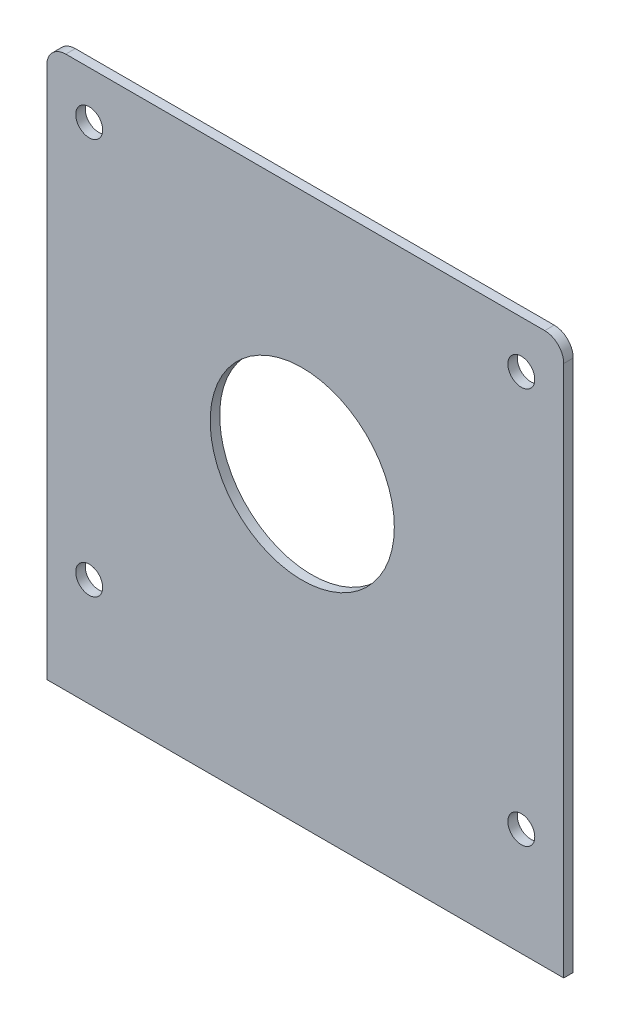
ISO-10303-21;
HEADER;
FILE_DESCRIPTION(('STEP AP214'),'2;1');
FILE_NAME('part.step','',(''),(''),'','','');
FILE_SCHEMA(('AUTOMOTIVE_DESIGN { 1 0 10303 214 1 1 1 1 }'));
ENDSEC;
DATA;
#1=APPLICATION_CONTEXT('core data for automotive mechanical design processes');
#2=APPLICATION_PROTOCOL_DEFINITION('international standard','automotive_design',2000,#1);
#3=PRODUCT_CONTEXT('',#1,'mechanical');
#4=PRODUCT('Part','Part','',(#3));
#5=PRODUCT_RELATED_PRODUCT_CATEGORY('part','',(#4));
#6=PRODUCT_DEFINITION_FORMATION('','',#4);
#7=PRODUCT_DEFINITION_CONTEXT('part definition',#1,'design');
#8=PRODUCT_DEFINITION('design','',#6,#7);
#9=PRODUCT_DEFINITION_SHAPE('','',#8);
#10=(LENGTH_UNIT() NAMED_UNIT(*) SI_UNIT(.MILLI.,.METRE.));
#11=(NAMED_UNIT(*) PLANE_ANGLE_UNIT() SI_UNIT($,.RADIAN.));
#12=(NAMED_UNIT(*) SI_UNIT($,.STERADIAN.) SOLID_ANGLE_UNIT());
#13=UNCERTAINTY_MEASURE_WITH_UNIT(LENGTH_MEASURE(1.E-05),#10,'distance_accuracy_value','');
#14=(GEOMETRIC_REPRESENTATION_CONTEXT(3) GLOBAL_UNCERTAINTY_ASSIGNED_CONTEXT((#13)) GLOBAL_UNIT_ASSIGNED_CONTEXT((#10,
#11,#12)) REPRESENTATION_CONTEXT('',''));
#15=CARTESIAN_POINT('',(0.,0.,0.));
#16=DIRECTION('',(0.,0.,1.));
#17=DIRECTION('',(1.,0.,0.));
#18=AXIS2_PLACEMENT_3D('',#15,#16,#17);
#19=CARTESIAN_POINT('',(43.18,-42.8625,0.79375));
#20=DIRECTION('',(-1.,0.,0.));
#21=DIRECTION('',(0.,0.,1.));
#22=AXIS2_PLACEMENT_3D('',#19,#20,#21);
#23=PLANE('',#22);
#24=DIRECTION('',(0.,1.,0.));
#25=VECTOR('',#24,1.);
#26=CARTESIAN_POINT('',(43.18,-42.8625,-0.79375));
#27=LINE('',#26,#25);
#28=CARTESIAN_POINT('',(43.18,-49.2125,-0.79375));
#29=VERTEX_POINT('',#28);
#30=CARTESIAN_POINT('',(43.18,39.6875,-0.79375));
#31=VERTEX_POINT('',#30);
#32=EDGE_CURVE('E113',#29,#31,#27,.T.);
#33=ORIENTED_EDGE('',*,*,#32,.T.);
#34=DIRECTION('',(0.,0.,-1.));
#35=VECTOR('',#34,1.);
#36=CARTESIAN_POINT('',(43.18,39.6875,0.79375));
#37=LINE('',#36,#35);
#38=CARTESIAN_POINT('',(43.18,39.6875,0.79375));
#39=VERTEX_POINT('',#38);
#40=EDGE_CURVE('E11',#31,#39,#37,.F.);
#41=ORIENTED_EDGE('',*,*,#40,.T.);
#42=DIRECTION('',(0.,1.,0.));
#43=VECTOR('',#42,1.);
#44=CARTESIAN_POINT('',(43.18,-42.8625,0.79375));
#45=LINE('',#44,#43);
#46=CARTESIAN_POINT('',(43.18,-49.2125,0.79375));
#47=VERTEX_POINT('',#46);
#48=EDGE_CURVE('E100',#47,#39,#45,.T.);
#49=ORIENTED_EDGE('',*,*,#48,.F.);
#50=DIRECTION('',(0.,0.,1.));
#51=VECTOR('',#50,1.);
#52=CARTESIAN_POINT('',(43.18,-49.2125,-0.79375));
#53=LINE('',#52,#51);
#54=EDGE_CURVE('E110',#29,#47,#53,.T.);
#55=ORIENTED_EDGE('',*,*,#54,.F.);
#56=EDGE_LOOP('',(#33,#41,#49,#55));
#57=FACE_BOUND('',#56,.T.);
#58=ADVANCED_FACE('F35',(#57),#23,.F.);
#59=CARTESIAN_POINT('',(43.18,42.8625,0.79375));
#60=DIRECTION('',(0.,-1.,0.));
#61=DIRECTION('',(0.,0.,-1.));
#62=AXIS2_PLACEMENT_3D('',#59,#60,#61);
#63=PLANE('',#62);
#64=DIRECTION('',(-1.,0.,0.));
#65=VECTOR('',#64,1.);
#66=CARTESIAN_POINT('',(43.18,42.8625,-0.79375));
#67=LINE('',#66,#65);
#68=CARTESIAN_POINT('',(40.005,42.8625,-0.79375));
#69=VERTEX_POINT('',#68);
#70=CARTESIAN_POINT('',(-40.005,42.8625,-0.79375));
#71=VERTEX_POINT('',#70);
#72=EDGE_CURVE('E101',#69,#71,#67,.T.);
#73=ORIENTED_EDGE('',*,*,#72,.T.);
#74=DIRECTION('',(0.,0.,-1.));
#75=VECTOR('',#74,1.);
#76=CARTESIAN_POINT('',(-40.005,42.8625,0.79375));
#77=LINE('',#76,#75);
#78=CARTESIAN_POINT('',(-40.005,42.8625,0.79375));
#79=VERTEX_POINT('',#78);
#80=EDGE_CURVE('E56',#71,#79,#77,.F.);
#81=ORIENTED_EDGE('',*,*,#80,.T.);
#82=DIRECTION('',(-1.,0.,0.));
#83=VECTOR('',#82,1.);
#84=CARTESIAN_POINT('',(43.18,42.8625,0.79375));
#85=LINE('',#84,#83);
#86=CARTESIAN_POINT('',(40.005,42.8625,0.79375));
#87=VERTEX_POINT('',#86);
#88=EDGE_CURVE('E150',#87,#79,#85,.T.);
#89=ORIENTED_EDGE('',*,*,#88,.F.);
#90=DIRECTION('',(0.,0.,-1.));
#91=VECTOR('',#90,1.);
#92=CARTESIAN_POINT('',(40.005,42.8625,0.79375));
#93=LINE('',#92,#91);
#94=EDGE_CURVE('E161',#87,#69,#93,.T.);
#95=ORIENTED_EDGE('',*,*,#94,.T.);
#96=EDGE_LOOP('',(#73,#81,#89,#95));
#97=FACE_BOUND('',#96,.T.);
#98=ADVANCED_FACE('F172',(#97),#63,.F.);
#99=CARTESIAN_POINT('',(-43.18,42.8625,0.79375));
#100=DIRECTION('',(1.,0.,0.));
#101=DIRECTION('',(0.,0.,-1.));
#102=AXIS2_PLACEMENT_3D('',#99,#100,#101);
#103=PLANE('',#102);
#104=DIRECTION('',(0.,-1.,0.));
#105=VECTOR('',#104,1.);
#106=CARTESIAN_POINT('',(-43.18,42.8625,0.79375));
#107=LINE('',#106,#105);
#108=CARTESIAN_POINT('',(-43.18,39.6875,0.79375));
#109=VERTEX_POINT('',#108);
#110=CARTESIAN_POINT('',(-43.18,-49.2125,0.79375));
#111=VERTEX_POINT('',#110);
#112=EDGE_CURVE('E152',#109,#111,#107,.T.);
#113=ORIENTED_EDGE('',*,*,#112,.F.);
#114=DIRECTION('',(0.,0.,-1.));
#115=VECTOR('',#114,1.);
#116=CARTESIAN_POINT('',(-43.18,39.6875,0.79375));
#117=LINE('',#116,#115);
#118=CARTESIAN_POINT('',(-43.18,39.6875,-0.79375));
#119=VERTEX_POINT('',#118);
#120=EDGE_CURVE('E97',#109,#119,#117,.T.);
#121=ORIENTED_EDGE('',*,*,#120,.T.);
#122=DIRECTION('',(0.,-1.,0.));
#123=VECTOR('',#122,1.);
#124=CARTESIAN_POINT('',(-43.18,42.8625,-0.79375));
#125=LINE('',#124,#123);
#126=CARTESIAN_POINT('',(-43.18,-49.2125,-0.79375));
#127=VERTEX_POINT('',#126);
#128=EDGE_CURVE('E90',#119,#127,#125,.T.);
#129=ORIENTED_EDGE('',*,*,#128,.T.);
#130=DIRECTION('',(0.,0.,1.));
#131=VECTOR('',#130,1.);
#132=CARTESIAN_POINT('',(-43.18,-49.2125,-0.79375));
#133=LINE('',#132,#131);
#134=EDGE_CURVE('E94',#127,#111,#133,.T.);
#135=ORIENTED_EDGE('',*,*,#134,.T.);
#136=EDGE_LOOP('',(#113,#121,#129,#135));
#137=FACE_BOUND('',#136,.T.);
#138=ADVANCED_FACE('F93',(#137),#103,.F.);
#139=CARTESIAN_POINT('',(0.,0.,0.79375));
#140=DIRECTION('',(0.,0.,1.));
#141=DIRECTION('',(1.,0.,0.));
#142=AXIS2_PLACEMENT_3D('',#139,#140,#141);
#143=PLANE('',#142);
#144=CARTESIAN_POINT('',(36.0913702497801,34.9538702497801,0.79375));
#145=DIRECTION('',(0.,0.,1.));
#146=DIRECTION('',(1.,0.,0.));
#147=AXIS2_PLACEMENT_3D('',#144,#145,#146);
#148=CIRCLE('',#147,2.25);
#149=CARTESIAN_POINT('',(38.3413702497801,34.9538702497801,0.79375));
#150=VERTEX_POINT('',#149);
#151=EDGE_CURVE('E118',#150,#150,#148,.T.);
#152=ORIENTED_EDGE('',*,*,#151,.F.);
#153=EDGE_LOOP('',(#152));
#154=FACE_BOUND('',#153,.T.);
#155=CARTESIAN_POINT('',(36.0913702497801,-31.2288702497801,0.79375));
#156=DIRECTION('',(0.,0.,1.));
#157=DIRECTION('',(1.,0.,0.));
#158=AXIS2_PLACEMENT_3D('',#155,#156,#157);
#159=CIRCLE('',#158,2.25);
#160=CARTESIAN_POINT('',(38.3413702497801,-31.2288702497801,0.79375));
#161=VERTEX_POINT('',#160);
#162=EDGE_CURVE('E125',#161,#161,#159,.T.);
#163=ORIENTED_EDGE('',*,*,#162,.F.);
#164=EDGE_LOOP('',(#163));
#165=FACE_BOUND('',#164,.T.);
#166=CARTESIAN_POINT('',(-36.0913702497801,34.9538702497801,0.79375));
#167=DIRECTION('',(0.,0.,1.));
#168=DIRECTION('',(1.,0.,0.));
#169=AXIS2_PLACEMENT_3D('',#166,#167,#168);
#170=CIRCLE('',#169,2.25);
#171=CARTESIAN_POINT('',(-33.8413702497801,34.9538702497801,0.79375));
#172=VERTEX_POINT('',#171);
#173=EDGE_CURVE('E131',#172,#172,#170,.T.);
#174=ORIENTED_EDGE('',*,*,#173,.F.);
#175=EDGE_LOOP('',(#174));
#176=FACE_BOUND('',#175,.T.);
#177=CARTESIAN_POINT('',(-36.0913702497801,-31.2288702497802,0.79375));
#178=DIRECTION('',(0.,0.,1.));
#179=DIRECTION('',(1.,0.,0.));
#180=AXIS2_PLACEMENT_3D('',#177,#178,#179);
#181=CIRCLE('',#180,2.25);
#182=CARTESIAN_POINT('',(-33.8413702497801,-31.2288702497802,0.79375));
#183=VERTEX_POINT('',#182);
#184=EDGE_CURVE('E137',#183,#183,#181,.T.);
#185=ORIENTED_EDGE('',*,*,#184,.F.);
#186=EDGE_LOOP('',(#185));
#187=FACE_BOUND('',#186,.T.);
#188=CARTESIAN_POINT('',(-0.500000000000037,1.8625,0.79375));
#189=DIRECTION('',(0.,0.,1.));
#190=DIRECTION('',(1.,0.,0.));
#191=AXIS2_PLACEMENT_3D('',#188,#189,#190);
#192=CIRCLE('',#191,15.380999972);
#193=CARTESIAN_POINT('',(14.880999972,1.8625,0.79375));
#194=VERTEX_POINT('',#193);
#195=EDGE_CURVE('E143',#194,#194,#192,.T.);
#196=ORIENTED_EDGE('',*,*,#195,.F.);
#197=EDGE_LOOP('',(#196));
#198=FACE_BOUND('',#197,.T.);
#199=ORIENTED_EDGE('',*,*,#88,.T.);
#200=CARTESIAN_POINT('',(-40.005,39.6875,0.79375));
#201=DIRECTION('',(0.,0.,1.));
#202=DIRECTION('',(1.,0.,0.));
#203=AXIS2_PLACEMENT_3D('',#200,#201,#202);
#204=CIRCLE('',#203,3.175);
#205=EDGE_CURVE('E43',#79,#109,#204,.T.);
#206=ORIENTED_EDGE('',*,*,#205,.T.);
#207=ORIENTED_EDGE('',*,*,#112,.T.);
#208=DIRECTION('',(1.,0.,0.));
#209=VECTOR('',#208,1.);
#210=CARTESIAN_POINT('',(43.18,-49.2125,0.79375));
#211=LINE('',#210,#209);
#212=EDGE_CURVE('E109',#111,#47,#211,.T.);
#213=ORIENTED_EDGE('',*,*,#212,.T.);
#214=ORIENTED_EDGE('',*,*,#48,.T.);
#215=CARTESIAN_POINT('',(40.005,39.6875,0.79375));
#216=DIRECTION('',(0.,0.,1.));
#217=DIRECTION('',(1.,0.,0.));
#218=AXIS2_PLACEMENT_3D('',#215,#216,#217);
#219=CIRCLE('',#218,3.175);
#220=EDGE_CURVE('E165',#39,#87,#219,.T.);
#221=ORIENTED_EDGE('',*,*,#220,.T.);
#222=EDGE_LOOP('',(#199,#206,#207,#213,#214,#221));
#223=FACE_BOUND('',#222,.T.);
#224=ADVANCED_FACE('F168',(#154,#165,#176,#187,#198,#223),#143,.T.);
#225=CARTESIAN_POINT('',(0.,0.,-0.79375));
#226=DIRECTION('',(0.,0.,1.));
#227=DIRECTION('',(1.,0.,0.));
#228=AXIS2_PLACEMENT_3D('',#225,#226,#227);
#229=PLANE('',#228);
#230=CARTESIAN_POINT('',(36.0913702497801,34.9538702497801,-0.79375));
#231=DIRECTION('',(0.,0.,1.));
#232=DIRECTION('',(1.,0.,0.));
#233=AXIS2_PLACEMENT_3D('',#230,#231,#232);
#234=CIRCLE('',#233,2.25);
#235=CARTESIAN_POINT('',(38.3413702497801,34.9538702497801,-0.79375));
#236=VERTEX_POINT('',#235);
#237=EDGE_CURVE('E122',#236,#236,#234,.T.);
#238=ORIENTED_EDGE('',*,*,#237,.T.);
#239=EDGE_LOOP('',(#238));
#240=FACE_BOUND('',#239,.T.);
#241=CARTESIAN_POINT('',(36.0913702497801,-31.2288702497801,-0.79375));
#242=DIRECTION('',(0.,0.,1.));
#243=DIRECTION('',(1.,0.,0.));
#244=AXIS2_PLACEMENT_3D('',#241,#242,#243);
#245=CIRCLE('',#244,2.25);
#246=CARTESIAN_POINT('',(38.3413702497801,-31.2288702497801,-0.79375));
#247=VERTEX_POINT('',#246);
#248=EDGE_CURVE('E128',#247,#247,#245,.T.);
#249=ORIENTED_EDGE('',*,*,#248,.T.);
#250=EDGE_LOOP('',(#249));
#251=FACE_BOUND('',#250,.T.);
#252=CARTESIAN_POINT('',(-36.0913702497801,34.9538702497801,-0.79375));
#253=DIRECTION('',(0.,0.,1.));
#254=DIRECTION('',(1.,0.,0.));
#255=AXIS2_PLACEMENT_3D('',#252,#253,#254);
#256=CIRCLE('',#255,2.25);
#257=CARTESIAN_POINT('',(-33.8413702497801,34.9538702497801,-0.79375));
#258=VERTEX_POINT('',#257);
#259=EDGE_CURVE('E134',#258,#258,#256,.T.);
#260=ORIENTED_EDGE('',*,*,#259,.T.);
#261=EDGE_LOOP('',(#260));
#262=FACE_BOUND('',#261,.T.);
#263=CARTESIAN_POINT('',(-36.0913702497801,-31.2288702497802,-0.79375));
#264=DIRECTION('',(0.,0.,1.));
#265=DIRECTION('',(1.,0.,0.));
#266=AXIS2_PLACEMENT_3D('',#263,#264,#265);
#267=CIRCLE('',#266,2.25);
#268=CARTESIAN_POINT('',(-33.8413702497801,-31.2288702497802,-0.79375));
#269=VERTEX_POINT('',#268);
#270=EDGE_CURVE('E140',#269,#269,#267,.T.);
#271=ORIENTED_EDGE('',*,*,#270,.T.);
#272=EDGE_LOOP('',(#271));
#273=FACE_BOUND('',#272,.T.);
#274=CARTESIAN_POINT('',(-0.500000000000037,1.8625,-0.79375));
#275=DIRECTION('',(0.,0.,1.));
#276=DIRECTION('',(1.,0.,0.));
#277=AXIS2_PLACEMENT_3D('',#274,#275,#276);
#278=CIRCLE('',#277,15.380999972);
#279=CARTESIAN_POINT('',(14.880999972,1.8625,-0.79375));
#280=VERTEX_POINT('',#279);
#281=EDGE_CURVE('E144',#280,#280,#278,.T.);
#282=ORIENTED_EDGE('',*,*,#281,.T.);
#283=EDGE_LOOP('',(#282));
#284=FACE_BOUND('',#283,.T.);
#285=ORIENTED_EDGE('',*,*,#128,.F.);
#286=CARTESIAN_POINT('',(-40.005,39.6875,-0.79375));
#287=DIRECTION('',(0.,0.,1.));
#288=DIRECTION('',(1.,0.,0.));
#289=AXIS2_PLACEMENT_3D('',#286,#287,#288);
#290=CIRCLE('',#289,3.175);
#291=EDGE_CURVE('E159',#119,#71,#290,.F.);
#292=ORIENTED_EDGE('',*,*,#291,.T.);
#293=ORIENTED_EDGE('',*,*,#72,.F.);
#294=CARTESIAN_POINT('',(40.005,39.6875,-0.79375));
#295=DIRECTION('',(0.,0.,1.));
#296=DIRECTION('',(1.,0.,0.));
#297=AXIS2_PLACEMENT_3D('',#294,#295,#296);
#298=CIRCLE('',#297,3.175);
#299=EDGE_CURVE('E157',#69,#31,#298,.F.);
#300=ORIENTED_EDGE('',*,*,#299,.T.);
#301=ORIENTED_EDGE('',*,*,#32,.F.);
#302=DIRECTION('',(1.,0.,0.));
#303=VECTOR('',#302,1.);
#304=CARTESIAN_POINT('',(43.18,-49.2125,-0.79375));
#305=LINE('',#304,#303);
#306=EDGE_CURVE('E107',#127,#29,#305,.T.);
#307=ORIENTED_EDGE('',*,*,#306,.F.);
#308=EDGE_LOOP('',(#285,#292,#293,#300,#301,#307));
#309=FACE_BOUND('',#308,.T.);
#310=ADVANCED_FACE('F112',(#240,#251,#262,#273,#284,#309),#229,.F.);
#311=CARTESIAN_POINT('',(-0.500000000000037,1.8625,-0.79375));
#312=DIRECTION('',(0.,0.,1.));
#313=DIRECTION('',(1.,0.,0.));
#314=AXIS2_PLACEMENT_3D('',#311,#312,#313);
#315=CYLINDRICAL_SURFACE('',#314,15.380999972);
#316=ORIENTED_EDGE('',*,*,#281,.F.);
#317=EDGE_LOOP('',(#316));
#318=FACE_BOUND('',#317,.T.);
#319=ORIENTED_EDGE('',*,*,#195,.T.);
#320=EDGE_LOOP('',(#319));
#321=FACE_BOUND('',#320,.T.);
#322=ADVANCED_FACE('F207',(#318,#321),#315,.F.);
#323=CARTESIAN_POINT('',(-36.0913702497801,-31.2288702497802,0.79375));
#324=DIRECTION('',(0.,0.,1.));
#325=DIRECTION('',(1.,0.,0.));
#326=AXIS2_PLACEMENT_3D('',#323,#324,#325);
#327=CYLINDRICAL_SURFACE('',#326,2.25);
#328=ORIENTED_EDGE('',*,*,#270,.F.);
#329=EDGE_LOOP('',(#328));
#330=FACE_BOUND('',#329,.T.);
#331=ORIENTED_EDGE('',*,*,#184,.T.);
#332=EDGE_LOOP('',(#331));
#333=FACE_BOUND('',#332,.T.);
#334=ADVANCED_FACE('F203',(#330,#333),#327,.F.);
#335=CARTESIAN_POINT('',(-36.0913702497801,34.9538702497801,0.79375));
#336=DIRECTION('',(0.,0.,1.));
#337=DIRECTION('',(1.,0.,0.));
#338=AXIS2_PLACEMENT_3D('',#335,#336,#337);
#339=CYLINDRICAL_SURFACE('',#338,2.25);
#340=ORIENTED_EDGE('',*,*,#259,.F.);
#341=EDGE_LOOP('',(#340));
#342=FACE_BOUND('',#341,.T.);
#343=ORIENTED_EDGE('',*,*,#173,.T.);
#344=EDGE_LOOP('',(#343));
#345=FACE_BOUND('',#344,.T.);
#346=ADVANCED_FACE('F199',(#342,#345),#339,.F.);
#347=CARTESIAN_POINT('',(36.0913702497801,-31.2288702497801,0.79375));
#348=DIRECTION('',(0.,0.,1.));
#349=DIRECTION('',(1.,0.,0.));
#350=AXIS2_PLACEMENT_3D('',#347,#348,#349);
#351=CYLINDRICAL_SURFACE('',#350,2.25);
#352=ORIENTED_EDGE('',*,*,#248,.F.);
#353=EDGE_LOOP('',(#352));
#354=FACE_BOUND('',#353,.T.);
#355=ORIENTED_EDGE('',*,*,#162,.T.);
#356=EDGE_LOOP('',(#355));
#357=FACE_BOUND('',#356,.T.);
#358=ADVANCED_FACE('F193',(#354,#357),#351,.F.);
#359=CARTESIAN_POINT('',(36.0913702497801,34.9538702497801,0.79375));
#360=DIRECTION('',(0.,0.,1.));
#361=DIRECTION('',(1.,0.,0.));
#362=AXIS2_PLACEMENT_3D('',#359,#360,#361);
#363=CYLINDRICAL_SURFACE('',#362,2.25);
#364=ORIENTED_EDGE('',*,*,#237,.F.);
#365=EDGE_LOOP('',(#364));
#366=FACE_BOUND('',#365,.T.);
#367=ORIENTED_EDGE('',*,*,#151,.T.);
#368=EDGE_LOOP('',(#367));
#369=FACE_BOUND('',#368,.T.);
#370=ADVANCED_FACE('F188',(#366,#369),#363,.F.);
#371=CARTESIAN_POINT('',(43.18,-49.2125,-0.79375));
#372=DIRECTION('',(0.,-1.,0.));
#373=DIRECTION('',(1.,0.,0.));
#374=AXIS2_PLACEMENT_3D('',#371,#372,#373);
#375=PLANE('',#374);
#376=ORIENTED_EDGE('',*,*,#212,.F.);
#377=ORIENTED_EDGE('',*,*,#134,.F.);
#378=ORIENTED_EDGE('',*,*,#306,.T.);
#379=ORIENTED_EDGE('',*,*,#54,.T.);
#380=EDGE_LOOP('',(#376,#377,#378,#379));
#381=FACE_BOUND('',#380,.T.);
#382=ADVANCED_FACE('F105',(#381),#375,.T.);
#383=CARTESIAN_POINT('',(-40.005,39.6875,0.79375));
#384=DIRECTION('',(0.,0.,-1.));
#385=DIRECTION('',(-1.,0.,0.));
#386=AXIS2_PLACEMENT_3D('',#383,#384,#385);
#387=CYLINDRICAL_SURFACE('',#386,3.175);
#388=ORIENTED_EDGE('',*,*,#205,.F.);
#389=ORIENTED_EDGE('',*,*,#80,.F.);
#390=ORIENTED_EDGE('',*,*,#291,.F.);
#391=ORIENTED_EDGE('',*,*,#120,.F.);
#392=EDGE_LOOP('',(#388,#389,#390,#391));
#393=FACE_BOUND('',#392,.T.);
#394=ADVANCED_FACE('F170',(#393),#387,.T.);
#395=CARTESIAN_POINT('',(40.005,39.6875,0.79375));
#396=DIRECTION('',(0.,0.,-1.));
#397=DIRECTION('',(-1.,0.,0.));
#398=AXIS2_PLACEMENT_3D('',#395,#396,#397);
#399=CYLINDRICAL_SURFACE('',#398,3.175);
#400=ORIENTED_EDGE('',*,*,#220,.F.);
#401=ORIENTED_EDGE('',*,*,#40,.F.);
#402=ORIENTED_EDGE('',*,*,#299,.F.);
#403=ORIENTED_EDGE('',*,*,#94,.F.);
#404=EDGE_LOOP('',(#400,#401,#402,#403));
#405=FACE_BOUND('',#404,.T.);
#406=ADVANCED_FACE('F37',(#405),#399,.T.);
#407=CLOSED_SHELL('',(#58,#98,#138,#224,#310,#322,#334,#346,#358,#370,#382,#394,#406));
#408=MANIFOLD_SOLID_BREP('B2',#407);
#409=ADVANCED_BREP_SHAPE_REPRESENTATION('',(#18,#408),#14);
#410=SHAPE_DEFINITION_REPRESENTATION(#9,#409);
ENDSEC;
END-ISO-10303-21;
